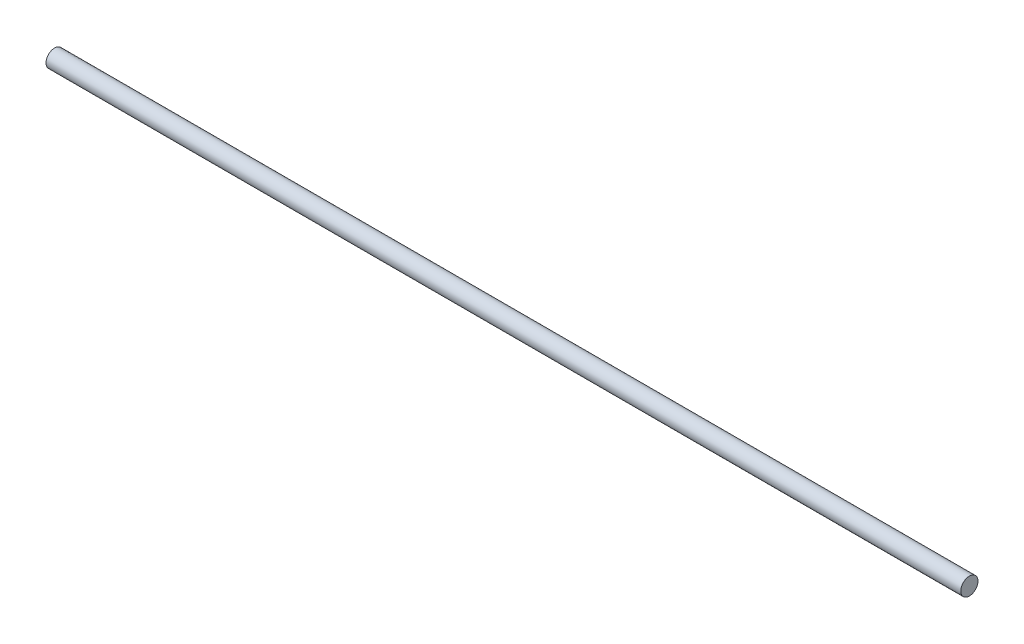
ISO-10303-21;
HEADER;
FILE_DESCRIPTION(('STEP AP214'),'2;1');
FILE_NAME('part.step','',(''),(''),'','','');
FILE_SCHEMA(('AUTOMOTIVE_DESIGN { 1 0 10303 214 1 1 1 1 }'));
ENDSEC;
DATA;
#1=APPLICATION_CONTEXT('core data for automotive mechanical design processes');
#2=APPLICATION_PROTOCOL_DEFINITION('international standard','automotive_design',2000,#1);
#3=PRODUCT_CONTEXT('',#1,'mechanical');
#4=PRODUCT('Part','Part','',(#3));
#5=PRODUCT_RELATED_PRODUCT_CATEGORY('part','',(#4));
#6=PRODUCT_DEFINITION_FORMATION('','',#4);
#7=PRODUCT_DEFINITION_CONTEXT('part definition',#1,'design');
#8=PRODUCT_DEFINITION('design','',#6,#7);
#9=PRODUCT_DEFINITION_SHAPE('','',#8);
#10=(LENGTH_UNIT() NAMED_UNIT(*) SI_UNIT(.MILLI.,.METRE.));
#11=(NAMED_UNIT(*) PLANE_ANGLE_UNIT() SI_UNIT($,.RADIAN.));
#12=(NAMED_UNIT(*) SI_UNIT($,.STERADIAN.) SOLID_ANGLE_UNIT());
#13=UNCERTAINTY_MEASURE_WITH_UNIT(LENGTH_MEASURE(1.E-05),#10,'distance_accuracy_value','');
#14=(GEOMETRIC_REPRESENTATION_CONTEXT(3) GLOBAL_UNCERTAINTY_ASSIGNED_CONTEXT((#13)) GLOBAL_UNIT_ASSIGNED_CONTEXT((#10,
#11,#12)) REPRESENTATION_CONTEXT('',''));
#15=CARTESIAN_POINT('',(0.,0.,0.));
#16=DIRECTION('',(0.,0.,1.));
#17=DIRECTION('',(1.,0.,0.));
#18=AXIS2_PLACEMENT_3D('',#15,#16,#17);
#19=CARTESIAN_POINT('',(2120.,0.,0.));
#20=DIRECTION('',(-1.,0.,0.));
#21=DIRECTION('',(0.,0.,1.));
#22=AXIS2_PLACEMENT_3D('',#19,#20,#21);
#23=CYLINDRICAL_SURFACE('',#22,20.);
#24=CARTESIAN_POINT('',(2120.,0.,0.));
#25=DIRECTION('',(1.,0.,0.));
#26=DIRECTION('',(0.,0.,-1.));
#27=AXIS2_PLACEMENT_3D('',#24,#25,#26);
#28=CIRCLE('',#27,20.);
#29=CARTESIAN_POINT('',(2120.,0.,-20.));
#30=VERTEX_POINT('',#29);
#31=EDGE_CURVE('E10',#30,#30,#28,.T.);
#32=ORIENTED_EDGE('',*,*,#31,.F.);
#33=EDGE_LOOP('',(#32));
#34=FACE_BOUND('',#33,.T.);
#35=CARTESIAN_POINT('',(0.,0.,0.));
#36=DIRECTION('',(1.,0.,0.));
#37=DIRECTION('',(0.,0.,-1.));
#38=AXIS2_PLACEMENT_3D('',#35,#36,#37);
#39=CIRCLE('',#38,20.);
#40=CARTESIAN_POINT('',(0.,0.,-20.));
#41=VERTEX_POINT('',#40);
#42=EDGE_CURVE('E39',#41,#41,#39,.T.);
#43=ORIENTED_EDGE('',*,*,#42,.T.);
#44=EDGE_LOOP('',(#43));
#45=FACE_BOUND('',#44,.T.);
#46=ADVANCED_FACE('F36',(#34,#45),#23,.T.);
#47=CARTESIAN_POINT('',(2120.,0.,0.));
#48=DIRECTION('',(1.,0.,0.));
#49=DIRECTION('',(0.,0.,-1.));
#50=AXIS2_PLACEMENT_3D('',#47,#48,#49);
#51=PLANE('',#50);
#52=ORIENTED_EDGE('',*,*,#31,.T.);
#53=EDGE_LOOP('',(#52));
#54=FACE_BOUND('',#53,.T.);
#55=ADVANCED_FACE('F51',(#54),#51,.T.);
#56=CARTESIAN_POINT('',(0.,0.,0.));
#57=DIRECTION('',(1.,0.,0.));
#58=DIRECTION('',(0.,0.,-1.));
#59=AXIS2_PLACEMENT_3D('',#56,#57,#58);
#60=PLANE('',#59);
#61=ORIENTED_EDGE('',*,*,#42,.F.);
#62=EDGE_LOOP('',(#61));
#63=FACE_BOUND('',#62,.T.);
#64=ADVANCED_FACE('F49',(#63),#60,.F.);
#65=CLOSED_SHELL('',(#46,#55,#64));
#66=MANIFOLD_SOLID_BREP('B2',#65);
#67=ADVANCED_BREP_SHAPE_REPRESENTATION('',(#18,#66),#14);
#68=SHAPE_DEFINITION_REPRESENTATION(#9,#67);
ENDSEC;
END-ISO-10303-21;
